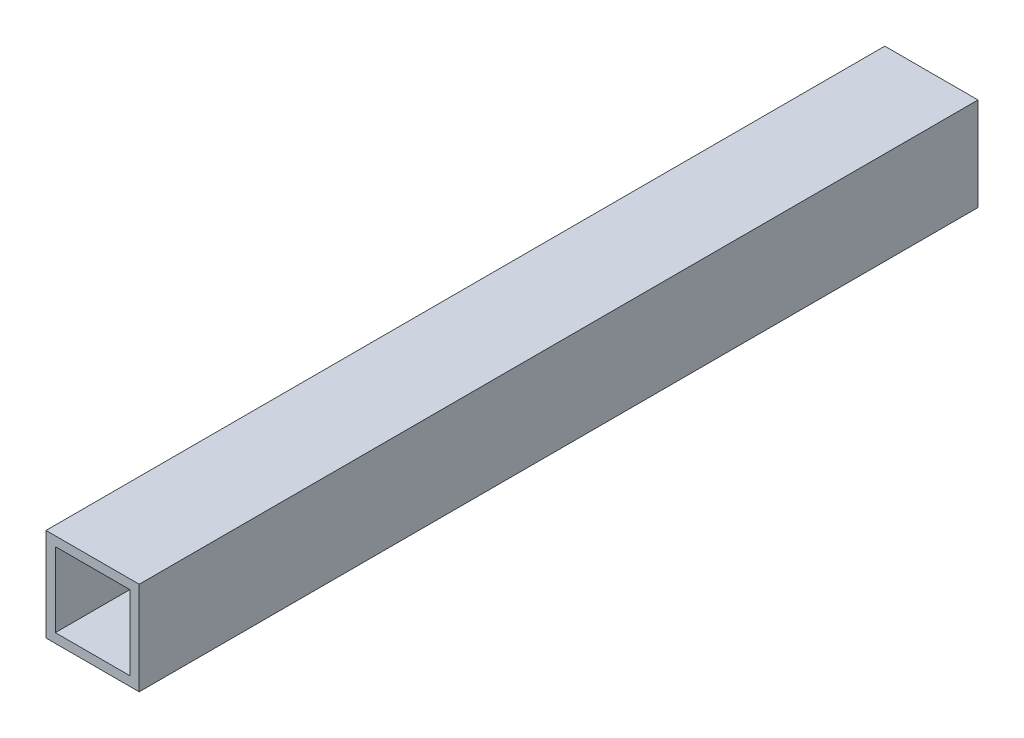
ISO-10303-21;
HEADER;
FILE_DESCRIPTION(('STEP AP214'),'2;1');
FILE_NAME('part.step','',(''),(''),'','','');
FILE_SCHEMA(('AUTOMOTIVE_DESIGN { 1 0 10303 214 1 1 1 1 }'));
ENDSEC;
DATA;
#1=APPLICATION_CONTEXT('core data for automotive mechanical design processes');
#2=APPLICATION_PROTOCOL_DEFINITION('international standard','automotive_design',2000,#1);
#3=PRODUCT_CONTEXT('',#1,'mechanical');
#4=PRODUCT('Part','Part','',(#3));
#5=PRODUCT_RELATED_PRODUCT_CATEGORY('part','',(#4));
#6=PRODUCT_DEFINITION_FORMATION('','',#4);
#7=PRODUCT_DEFINITION_CONTEXT('part definition',#1,'design');
#8=PRODUCT_DEFINITION('design','',#6,#7);
#9=PRODUCT_DEFINITION_SHAPE('','',#8);
#10=(LENGTH_UNIT() NAMED_UNIT(*) SI_UNIT(.MILLI.,.METRE.));
#11=(NAMED_UNIT(*) PLANE_ANGLE_UNIT() SI_UNIT($,.RADIAN.));
#12=(NAMED_UNIT(*) SI_UNIT($,.STERADIAN.) SOLID_ANGLE_UNIT());
#13=UNCERTAINTY_MEASURE_WITH_UNIT(LENGTH_MEASURE(1.E-05),#10,'distance_accuracy_value','');
#14=(GEOMETRIC_REPRESENTATION_CONTEXT(3) GLOBAL_UNCERTAINTY_ASSIGNED_CONTEXT((#13)) GLOBAL_UNIT_ASSIGNED_CONTEXT((#10,
#11,#12)) REPRESENTATION_CONTEXT('',''));
#15=CARTESIAN_POINT('',(0.,0.,0.));
#16=DIRECTION('',(0.,0.,1.));
#17=DIRECTION('',(1.,0.,0.));
#18=AXIS2_PLACEMENT_3D('',#15,#16,#17);
#19=CARTESIAN_POINT('',(0.,0.,228.6));
#20=DIRECTION('',(0.,0.,-1.));
#21=DIRECTION('',(-1.,0.,0.));
#22=AXIS2_PLACEMENT_3D('',#19,#20,#21);
#23=PLANE('',#22);
#24=DIRECTION('',(0.,1.,0.));
#25=VECTOR('',#24,1.);
#26=CARTESIAN_POINT('',(12.7,-12.7,228.6));
#27=LINE('',#26,#25);
#28=CARTESIAN_POINT('',(12.7,-12.7,228.6));
#29=VERTEX_POINT('',#28);
#30=CARTESIAN_POINT('',(12.7,12.7,228.6));
#31=VERTEX_POINT('',#30);
#32=EDGE_CURVE('E134',#29,#31,#27,.T.);
#33=ORIENTED_EDGE('',*,*,#32,.T.);
#34=DIRECTION('',(-1.,0.,0.));
#35=VECTOR('',#34,1.);
#36=CARTESIAN_POINT('',(-12.7,12.7,228.6));
#37=LINE('',#36,#35);
#38=CARTESIAN_POINT('',(-12.7,12.7,228.6));
#39=VERTEX_POINT('',#38);
#40=EDGE_CURVE('E137',#31,#39,#37,.T.);
#41=ORIENTED_EDGE('',*,*,#40,.T.);
#42=DIRECTION('',(0.,-1.,0.));
#43=VECTOR('',#42,1.);
#44=CARTESIAN_POINT('',(-12.7,-12.7,228.6));
#45=LINE('',#44,#43);
#46=CARTESIAN_POINT('',(-12.7,-12.7,228.6));
#47=VERTEX_POINT('',#46);
#48=EDGE_CURVE('E140',#39,#47,#45,.T.);
#49=ORIENTED_EDGE('',*,*,#48,.T.);
#50=DIRECTION('',(1.,0.,0.));
#51=VECTOR('',#50,1.);
#52=CARTESIAN_POINT('',(-12.7,-12.7,228.6));
#53=LINE('',#52,#51);
#54=EDGE_CURVE('E142',#47,#29,#53,.T.);
#55=ORIENTED_EDGE('',*,*,#54,.T.);
#56=EDGE_LOOP('',(#33,#41,#49,#55));
#57=FACE_BOUND('',#56,.T.);
#58=DIRECTION('',(0.,-1.,0.));
#59=VECTOR('',#58,1.);
#60=CARTESIAN_POINT('',(-10.16,-10.16,228.6));
#61=LINE('',#60,#59);
#62=CARTESIAN_POINT('',(-10.16,10.16,228.6));
#63=VERTEX_POINT('',#62);
#64=CARTESIAN_POINT('',(-10.16,-10.16,228.6));
#65=VERTEX_POINT('',#64);
#66=EDGE_CURVE('E98',#63,#65,#61,.T.);
#67=ORIENTED_EDGE('',*,*,#66,.F.);
#68=DIRECTION('',(-1.,0.,0.));
#69=VECTOR('',#68,1.);
#70=CARTESIAN_POINT('',(-10.16,10.16,228.6));
#71=LINE('',#70,#69);
#72=CARTESIAN_POINT('',(10.16,10.16,228.6));
#73=VERTEX_POINT('',#72);
#74=EDGE_CURVE('E120',#73,#63,#71,.T.);
#75=ORIENTED_EDGE('',*,*,#74,.F.);
#76=DIRECTION('',(0.,1.,0.));
#77=VECTOR('',#76,1.);
#78=CARTESIAN_POINT('',(10.16,-10.16,228.6));
#79=LINE('',#78,#77);
#80=CARTESIAN_POINT('',(10.16,-10.16,228.6));
#81=VERTEX_POINT('',#80);
#82=EDGE_CURVE('E118',#81,#73,#79,.T.);
#83=ORIENTED_EDGE('',*,*,#82,.F.);
#84=DIRECTION('',(1.,0.,0.));
#85=VECTOR('',#84,1.);
#86=CARTESIAN_POINT('',(-10.16,-10.16,228.6));
#87=LINE('',#86,#85);
#88=EDGE_CURVE('E106',#65,#81,#87,.T.);
#89=ORIENTED_EDGE('',*,*,#88,.F.);
#90=EDGE_LOOP('',(#67,#75,#83,#89));
#91=FACE_BOUND('',#90,.T.);
#92=ADVANCED_FACE('F33',(#57,#91),#23,.F.);
#93=CARTESIAN_POINT('',(0.,0.,0.));
#94=DIRECTION('',(0.,0.,-1.));
#95=DIRECTION('',(-1.,0.,0.));
#96=AXIS2_PLACEMENT_3D('',#93,#94,#95);
#97=PLANE('',#96);
#98=DIRECTION('',(0.,1.,0.));
#99=VECTOR('',#98,1.);
#100=CARTESIAN_POINT('',(12.7,-12.7,0.));
#101=LINE('',#100,#99);
#102=CARTESIAN_POINT('',(12.7,-12.7,0.));
#103=VERTEX_POINT('',#102);
#104=CARTESIAN_POINT('',(12.7,12.7,0.));
#105=VERTEX_POINT('',#104);
#106=EDGE_CURVE('E114',#103,#105,#101,.T.);
#107=ORIENTED_EDGE('',*,*,#106,.F.);
#108=DIRECTION('',(1.,0.,0.));
#109=VECTOR('',#108,1.);
#110=CARTESIAN_POINT('',(-12.7,-12.7,0.));
#111=LINE('',#110,#109);
#112=CARTESIAN_POINT('',(-12.7,-12.7,0.));
#113=VERTEX_POINT('',#112);
#114=EDGE_CURVE('E138',#113,#103,#111,.T.);
#115=ORIENTED_EDGE('',*,*,#114,.F.);
#116=DIRECTION('',(0.,-1.,0.));
#117=VECTOR('',#116,1.);
#118=CARTESIAN_POINT('',(-12.7,-12.7,0.));
#119=LINE('',#118,#117);
#120=CARTESIAN_POINT('',(-12.7,12.7,0.));
#121=VERTEX_POINT('',#120);
#122=EDGE_CURVE('E149',#121,#113,#119,.T.);
#123=ORIENTED_EDGE('',*,*,#122,.F.);
#124=DIRECTION('',(-1.,0.,0.));
#125=VECTOR('',#124,1.);
#126=CARTESIAN_POINT('',(-12.7,12.7,0.));
#127=LINE('',#126,#125);
#128=EDGE_CURVE('E147',#105,#121,#127,.T.);
#129=ORIENTED_EDGE('',*,*,#128,.F.);
#130=EDGE_LOOP('',(#107,#115,#123,#129));
#131=FACE_BOUND('',#130,.T.);
#132=DIRECTION('',(-1.,0.,0.));
#133=VECTOR('',#132,1.);
#134=CARTESIAN_POINT('',(-10.16,10.16,0.));
#135=LINE('',#134,#133);
#136=CARTESIAN_POINT('',(10.16,10.16,0.));
#137=VERTEX_POINT('',#136);
#138=CARTESIAN_POINT('',(-10.16,10.16,0.));
#139=VERTEX_POINT('',#138);
#140=EDGE_CURVE('E107',#137,#139,#135,.T.);
#141=ORIENTED_EDGE('',*,*,#140,.T.);
#142=DIRECTION('',(0.,-1.,0.));
#143=VECTOR('',#142,1.);
#144=CARTESIAN_POINT('',(-10.16,-10.16,0.));
#145=LINE('',#144,#143);
#146=CARTESIAN_POINT('',(-10.16,-10.16,0.));
#147=VERTEX_POINT('',#146);
#148=EDGE_CURVE('E56',#139,#147,#145,.T.);
#149=ORIENTED_EDGE('',*,*,#148,.T.);
#150=DIRECTION('',(1.,0.,0.));
#151=VECTOR('',#150,1.);
#152=CARTESIAN_POINT('',(-10.16,-10.16,0.));
#153=LINE('',#152,#151);
#154=CARTESIAN_POINT('',(10.16,-10.16,0.));
#155=VERTEX_POINT('',#154);
#156=EDGE_CURVE('E113',#147,#155,#153,.T.);
#157=ORIENTED_EDGE('',*,*,#156,.T.);
#158=DIRECTION('',(0.,1.,0.));
#159=VECTOR('',#158,1.);
#160=CARTESIAN_POINT('',(10.16,-10.16,0.));
#161=LINE('',#160,#159);
#162=EDGE_CURVE('E126',#155,#137,#161,.T.);
#163=ORIENTED_EDGE('',*,*,#162,.T.);
#164=EDGE_LOOP('',(#141,#149,#157,#163));
#165=FACE_BOUND('',#164,.T.);
#166=ADVANCED_FACE('F167',(#131,#165),#97,.T.);
#167=CARTESIAN_POINT('',(12.7,-12.7,228.6));
#168=DIRECTION('',(-1.,0.,0.));
#169=DIRECTION('',(0.,0.,1.));
#170=AXIS2_PLACEMENT_3D('',#167,#168,#169);
#171=PLANE('',#170);
#172=ORIENTED_EDGE('',*,*,#106,.T.);
#173=DIRECTION('',(0.,0.,-1.));
#174=VECTOR('',#173,1.);
#175=CARTESIAN_POINT('',(12.7,12.7,228.6));
#176=LINE('',#175,#174);
#177=EDGE_CURVE('E11',#31,#105,#176,.T.);
#178=ORIENTED_EDGE('',*,*,#177,.F.);
#179=ORIENTED_EDGE('',*,*,#32,.F.);
#180=DIRECTION('',(0.,0.,-1.));
#181=VECTOR('',#180,1.);
#182=CARTESIAN_POINT('',(12.7,-12.7,228.6));
#183=LINE('',#182,#181);
#184=EDGE_CURVE('E144',#29,#103,#183,.T.);
#185=ORIENTED_EDGE('',*,*,#184,.T.);
#186=EDGE_LOOP('',(#172,#178,#179,#185));
#187=FACE_BOUND('',#186,.T.);
#188=ADVANCED_FACE('F35',(#187),#171,.F.);
#189=CARTESIAN_POINT('',(-12.7,12.7,228.6));
#190=DIRECTION('',(0.,-1.,0.));
#191=DIRECTION('',(0.,0.,-1.));
#192=AXIS2_PLACEMENT_3D('',#189,#190,#191);
#193=PLANE('',#192);
#194=ORIENTED_EDGE('',*,*,#128,.T.);
#195=DIRECTION('',(0.,0.,-1.));
#196=VECTOR('',#195,1.);
#197=CARTESIAN_POINT('',(-12.7,12.7,228.6));
#198=LINE('',#197,#196);
#199=EDGE_CURVE('E41',#39,#121,#198,.T.);
#200=ORIENTED_EDGE('',*,*,#199,.F.);
#201=ORIENTED_EDGE('',*,*,#40,.F.);
#202=ORIENTED_EDGE('',*,*,#177,.T.);
#203=EDGE_LOOP('',(#194,#200,#201,#202));
#204=FACE_BOUND('',#203,.T.);
#205=ADVANCED_FACE('F177',(#204),#193,.F.);
#206=CARTESIAN_POINT('',(-12.7,-12.7,228.6));
#207=DIRECTION('',(1.,0.,0.));
#208=DIRECTION('',(0.,0.,-1.));
#209=AXIS2_PLACEMENT_3D('',#206,#207,#208);
#210=PLANE('',#209);
#211=ORIENTED_EDGE('',*,*,#122,.T.);
#212=DIRECTION('',(0.,0.,-1.));
#213=VECTOR('',#212,1.);
#214=CARTESIAN_POINT('',(-12.7,-12.7,228.6));
#215=LINE('',#214,#213);
#216=EDGE_CURVE('E154',#47,#113,#215,.T.);
#217=ORIENTED_EDGE('',*,*,#216,.F.);
#218=ORIENTED_EDGE('',*,*,#48,.F.);
#219=ORIENTED_EDGE('',*,*,#199,.T.);
#220=EDGE_LOOP('',(#211,#217,#218,#219));
#221=FACE_BOUND('',#220,.T.);
#222=ADVANCED_FACE('F161',(#221),#210,.F.);
#223=CARTESIAN_POINT('',(-12.7,-12.7,228.6));
#224=DIRECTION('',(0.,1.,0.));
#225=DIRECTION('',(0.,0.,1.));
#226=AXIS2_PLACEMENT_3D('',#223,#224,#225);
#227=PLANE('',#226);
#228=ORIENTED_EDGE('',*,*,#114,.T.);
#229=ORIENTED_EDGE('',*,*,#184,.F.);
#230=ORIENTED_EDGE('',*,*,#54,.F.);
#231=ORIENTED_EDGE('',*,*,#216,.T.);
#232=EDGE_LOOP('',(#228,#229,#230,#231));
#233=FACE_BOUND('',#232,.T.);
#234=ADVANCED_FACE('F171',(#233),#227,.F.);
#235=CARTESIAN_POINT('',(-10.16,-10.16,228.6));
#236=DIRECTION('',(1.,0.,0.));
#237=DIRECTION('',(0.,0.,-1.));
#238=AXIS2_PLACEMENT_3D('',#235,#236,#237);
#239=PLANE('',#238);
#240=ORIENTED_EDGE('',*,*,#148,.F.);
#241=DIRECTION('',(0.,0.,-1.));
#242=VECTOR('',#241,1.);
#243=CARTESIAN_POINT('',(-10.16,10.16,228.6));
#244=LINE('',#243,#242);
#245=EDGE_CURVE('E102',#63,#139,#244,.T.);
#246=ORIENTED_EDGE('',*,*,#245,.F.);
#247=ORIENTED_EDGE('',*,*,#66,.T.);
#248=DIRECTION('',(0.,0.,-1.));
#249=VECTOR('',#248,1.);
#250=CARTESIAN_POINT('',(-10.16,-10.16,228.6));
#251=LINE('',#250,#249);
#252=EDGE_CURVE('E101',#65,#147,#251,.T.);
#253=ORIENTED_EDGE('',*,*,#252,.T.);
#254=EDGE_LOOP('',(#240,#246,#247,#253));
#255=FACE_BOUND('',#254,.T.);
#256=ADVANCED_FACE('F100',(#255),#239,.T.);
#257=CARTESIAN_POINT('',(-10.16,-10.16,228.6));
#258=DIRECTION('',(0.,1.,0.));
#259=DIRECTION('',(-1.,0.,0.));
#260=AXIS2_PLACEMENT_3D('',#257,#258,#259);
#261=PLANE('',#260);
#262=ORIENTED_EDGE('',*,*,#156,.F.);
#263=ORIENTED_EDGE('',*,*,#252,.F.);
#264=ORIENTED_EDGE('',*,*,#88,.T.);
#265=DIRECTION('',(0.,0.,-1.));
#266=VECTOR('',#265,1.);
#267=CARTESIAN_POINT('',(10.16,-10.16,228.6));
#268=LINE('',#267,#266);
#269=EDGE_CURVE('E115',#81,#155,#268,.T.);
#270=ORIENTED_EDGE('',*,*,#269,.T.);
#271=EDGE_LOOP('',(#262,#263,#264,#270));
#272=FACE_BOUND('',#271,.T.);
#273=ADVANCED_FACE('F110',(#272),#261,.T.);
#274=CARTESIAN_POINT('',(10.16,-10.16,228.6));
#275=DIRECTION('',(-1.,0.,0.));
#276=DIRECTION('',(0.,0.,1.));
#277=AXIS2_PLACEMENT_3D('',#274,#275,#276);
#278=PLANE('',#277);
#279=ORIENTED_EDGE('',*,*,#162,.F.);
#280=ORIENTED_EDGE('',*,*,#269,.F.);
#281=ORIENTED_EDGE('',*,*,#82,.T.);
#282=DIRECTION('',(0.,0.,-1.));
#283=VECTOR('',#282,1.);
#284=CARTESIAN_POINT('',(10.16,10.16,228.6));
#285=LINE('',#284,#283);
#286=EDGE_CURVE('E48',#73,#137,#285,.T.);
#287=ORIENTED_EDGE('',*,*,#286,.T.);
#288=EDGE_LOOP('',(#279,#280,#281,#287));
#289=FACE_BOUND('',#288,.T.);
#290=ADVANCED_FACE('F200',(#289),#278,.T.);
#291=CARTESIAN_POINT('',(-10.16,10.16,228.6));
#292=DIRECTION('',(0.,-1.,0.));
#293=DIRECTION('',(1.,0.,0.));
#294=AXIS2_PLACEMENT_3D('',#291,#292,#293);
#295=PLANE('',#294);
#296=ORIENTED_EDGE('',*,*,#140,.F.);
#297=ORIENTED_EDGE('',*,*,#286,.F.);
#298=ORIENTED_EDGE('',*,*,#74,.T.);
#299=ORIENTED_EDGE('',*,*,#245,.T.);
#300=EDGE_LOOP('',(#296,#297,#298,#299));
#301=FACE_BOUND('',#300,.T.);
#302=ADVANCED_FACE('F204',(#301),#295,.T.);
#303=CLOSED_SHELL('',(#92,#166,#188,#205,#222,#234,#256,#273,#290,#302));
#304=MANIFOLD_SOLID_BREP('B2',#303);
#305=ADVANCED_BREP_SHAPE_REPRESENTATION('',(#18,#304),#14);
#306=SHAPE_DEFINITION_REPRESENTATION(#9,#305);
ENDSEC;
END-ISO-10303-21;
